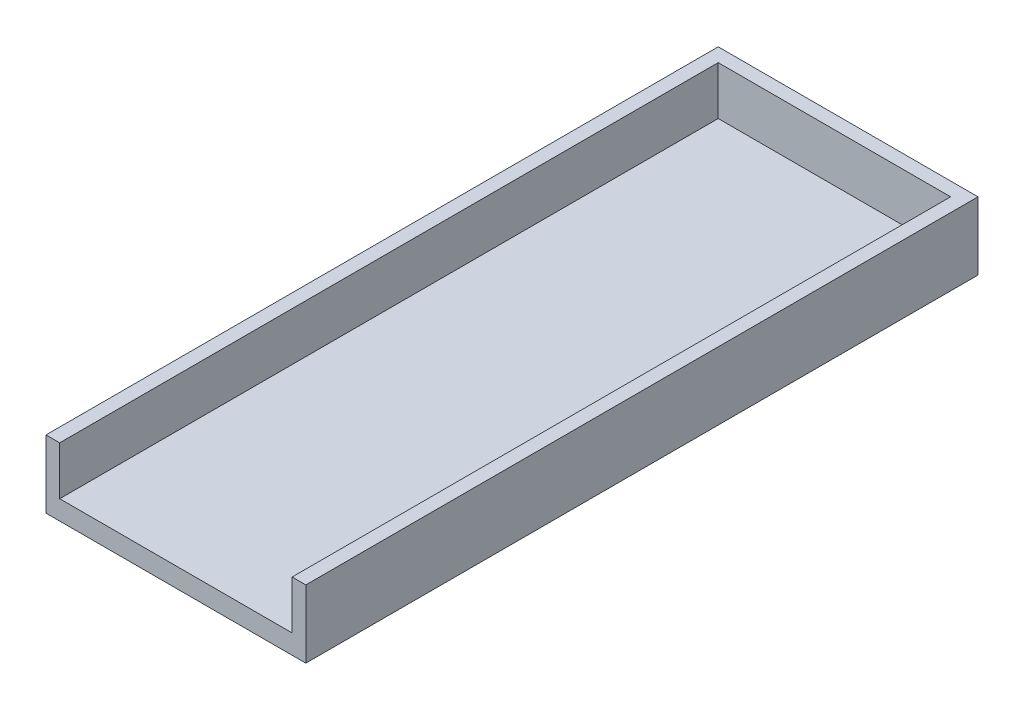
ISO-10303-21;
HEADER;
FILE_DESCRIPTION(('STEP AP214'),'2;1');
FILE_NAME('part.step','',(''),(''),'','','');
FILE_SCHEMA(('AUTOMOTIVE_DESIGN { 1 0 10303 214 1 1 1 1 }'));
ENDSEC;
DATA;
#1=APPLICATION_CONTEXT('core data for automotive mechanical design processes');
#2=APPLICATION_PROTOCOL_DEFINITION('international standard','automotive_design',2000,#1);
#3=PRODUCT_CONTEXT('',#1,'mechanical');
#4=PRODUCT('Part','Part','',(#3));
#5=PRODUCT_RELATED_PRODUCT_CATEGORY('part','',(#4));
#6=PRODUCT_DEFINITION_FORMATION('','',#4);
#7=PRODUCT_DEFINITION_CONTEXT('part definition',#1,'design');
#8=PRODUCT_DEFINITION('design','',#6,#7);
#9=PRODUCT_DEFINITION_SHAPE('','',#8);
#10=(LENGTH_UNIT() NAMED_UNIT(*) SI_UNIT(.MILLI.,.METRE.));
#11=(NAMED_UNIT(*) PLANE_ANGLE_UNIT() SI_UNIT($,.RADIAN.));
#12=(NAMED_UNIT(*) SI_UNIT($,.STERADIAN.) SOLID_ANGLE_UNIT());
#13=UNCERTAINTY_MEASURE_WITH_UNIT(LENGTH_MEASURE(1.E-05),#10,'distance_accuracy_value','');
#14=(GEOMETRIC_REPRESENTATION_CONTEXT(3) GLOBAL_UNCERTAINTY_ASSIGNED_CONTEXT((#13)) GLOBAL_UNIT_ASSIGNED_CONTEXT((#10,
#11,#12)) REPRESENTATION_CONTEXT('',''));
#15=CARTESIAN_POINT('',(0.,0.,0.));
#16=DIRECTION('',(0.,0.,1.));
#17=DIRECTION('',(1.,0.,0.));
#18=AXIS2_PLACEMENT_3D('',#15,#16,#17);
#19=CARTESIAN_POINT('',(0.,12.5,0.));
#20=DIRECTION('',(-1.,0.,0.));
#21=DIRECTION('',(0.,0.,1.));
#22=AXIS2_PLACEMENT_3D('',#19,#20,#21);
#23=PLANE('',#22);
#24=DIRECTION('',(0.,0.,-1.));
#25=VECTOR('',#24,1.);
#26=CARTESIAN_POINT('',(0.,12.5,0.));
#27=LINE('',#26,#25);
#28=CARTESIAN_POINT('',(0.,12.5,-160.));
#29=VERTEX_POINT('',#28);
#30=CARTESIAN_POINT('',(0.,12.5,-330.));
#31=VERTEX_POINT('',#30);
#32=EDGE_CURVE('E116',#29,#31,#27,.T.);
#33=ORIENTED_EDGE('',*,*,#32,.F.);
#34=DIRECTION('',(0.,1.,0.));
#35=VECTOR('',#34,1.);
#36=CARTESIAN_POINT('',(0.,0.,-160.));
#37=LINE('',#36,#35);
#38=CARTESIAN_POINT('',(0.,0.,-160.));
#39=VERTEX_POINT('',#38);
#40=EDGE_CURVE('E115',#39,#29,#37,.T.);
#41=ORIENTED_EDGE('',*,*,#40,.F.);
#42=DIRECTION('',(0.,0.,-1.));
#43=VECTOR('',#42,1.);
#44=CARTESIAN_POINT('',(0.,0.,0.));
#45=LINE('',#44,#43);
#46=CARTESIAN_POINT('',(0.,0.,-330.));
#47=VERTEX_POINT('',#46);
#48=EDGE_CURVE('E102',#39,#47,#45,.T.);
#49=ORIENTED_EDGE('',*,*,#48,.T.);
#50=DIRECTION('',(0.,-1.,0.));
#51=VECTOR('',#50,1.);
#52=CARTESIAN_POINT('',(0.,12.5,-330.));
#53=LINE('',#52,#51);
#54=EDGE_CURVE('E11',#31,#47,#53,.T.);
#55=ORIENTED_EDGE('',*,*,#54,.F.);
#56=EDGE_LOOP('',(#33,#41,#49,#55));
#57=FACE_BOUND('',#56,.T.);
#58=ADVANCED_FACE('F39',(#57),#23,.F.);
#59=CARTESIAN_POINT('',(0.,12.5,-330.));
#60=DIRECTION('',(0.,0.,-1.));
#61=DIRECTION('',(-1.,0.,0.));
#62=AXIS2_PLACEMENT_3D('',#59,#60,#61);
#63=PLANE('',#62);
#64=DIRECTION('',(1.,0.,0.));
#65=VECTOR('',#64,1.);
#66=CARTESIAN_POINT('',(0.,0.,-330.));
#67=LINE('',#66,#65);
#68=CARTESIAN_POINT('',(60.,0.,-330.));
#69=VERTEX_POINT('',#68);
#70=EDGE_CURVE('E109',#47,#69,#67,.T.);
#71=ORIENTED_EDGE('',*,*,#70,.T.);
#72=DIRECTION('',(0.,-1.,0.));
#73=VECTOR('',#72,1.);
#74=CARTESIAN_POINT('',(60.,12.5,-330.));
#75=LINE('',#74,#73);
#76=CARTESIAN_POINT('',(60.,12.5,-330.));
#77=VERTEX_POINT('',#76);
#78=EDGE_CURVE('E49',#77,#69,#75,.T.);
#79=ORIENTED_EDGE('',*,*,#78,.F.);
#80=DIRECTION('',(1.,0.,0.));
#81=VECTOR('',#80,1.);
#82=CARTESIAN_POINT('',(0.,12.5,-330.));
#83=LINE('',#82,#81);
#84=EDGE_CURVE('E156',#31,#77,#83,.T.);
#85=ORIENTED_EDGE('',*,*,#84,.F.);
#86=ORIENTED_EDGE('',*,*,#54,.T.);
#87=EDGE_LOOP('',(#71,#79,#85,#86));
#88=FACE_BOUND('',#87,.T.);
#89=ADVANCED_FACE('F184',(#88),#63,.F.);
#90=CARTESIAN_POINT('',(60.,12.5,0.));
#91=DIRECTION('',(-1.,0.,0.));
#92=DIRECTION('',(0.,0.,1.));
#93=AXIS2_PLACEMENT_3D('',#90,#91,#92);
#94=PLANE('',#93);
#95=DIRECTION('',(0.,0.,-1.));
#96=VECTOR('',#95,1.);
#97=CARTESIAN_POINT('',(60.,0.,0.));
#98=LINE('',#97,#96);
#99=CARTESIAN_POINT('',(60.,0.,-160.));
#100=VERTEX_POINT('',#99);
#101=EDGE_CURVE('E151',#100,#69,#98,.T.);
#102=ORIENTED_EDGE('',*,*,#101,.F.);
#103=DIRECTION('',(0.,-1.,0.));
#104=VECTOR('',#103,1.);
#105=CARTESIAN_POINT('',(60.,0.,-160.));
#106=LINE('',#105,#104);
#107=CARTESIAN_POINT('',(60.,12.5,-160.));
#108=VERTEX_POINT('',#107);
#109=EDGE_CURVE('E125',#108,#100,#106,.T.);
#110=ORIENTED_EDGE('',*,*,#109,.F.);
#111=DIRECTION('',(0.,0.,-1.));
#112=VECTOR('',#111,1.);
#113=CARTESIAN_POINT('',(60.,12.5,0.));
#114=LINE('',#113,#112);
#115=EDGE_CURVE('E57',#108,#77,#114,.T.);
#116=ORIENTED_EDGE('',*,*,#115,.T.);
#117=ORIENTED_EDGE('',*,*,#78,.T.);
#118=EDGE_LOOP('',(#102,#110,#116,#117));
#119=FACE_BOUND('',#118,.T.);
#120=ADVANCED_FACE('F185',(#119),#94,.T.);
#121=CARTESIAN_POINT('',(0.,12.5,-333.535533905933));
#122=DIRECTION('',(0.,0.,1.));
#123=DIRECTION('',(1.,0.,0.));
#124=AXIS2_PLACEMENT_3D('',#121,#122,#123);
#125=PLANE('',#124);
#126=DIRECTION('',(0.,-1.,0.));
#127=VECTOR('',#126,1.);
#128=CARTESIAN_POINT('',(63.5355339059327,12.5,-333.535533905933));
#129=LINE('',#128,#127);
#130=CARTESIAN_POINT('',(63.5355339059327,12.5,-333.535533905933));
#131=VERTEX_POINT('',#130);
#132=CARTESIAN_POINT('',(63.5355339059327,-5.,-333.535533905933));
#133=VERTEX_POINT('',#132);
#134=EDGE_CURVE('E158',#131,#133,#129,.T.);
#135=ORIENTED_EDGE('',*,*,#134,.T.);
#136=DIRECTION('',(1.,0.,0.));
#137=VECTOR('',#136,1.);
#138=CARTESIAN_POINT('',(-3.53553390593271,-5.,-333.535533905933));
#139=LINE('',#138,#137);
#140=CARTESIAN_POINT('',(-3.53553390593271,-5.,-333.535533905933));
#141=VERTEX_POINT('',#140);
#142=EDGE_CURVE('E143',#141,#133,#139,.T.);
#143=ORIENTED_EDGE('',*,*,#142,.F.);
#144=DIRECTION('',(0.,-1.,0.));
#145=VECTOR('',#144,1.);
#146=CARTESIAN_POINT('',(-3.53553390593267,12.5,-333.535533905933));
#147=LINE('',#146,#145);
#148=CARTESIAN_POINT('',(-3.53553390593267,12.5,-333.535533905933));
#149=VERTEX_POINT('',#148);
#150=EDGE_CURVE('E43',#149,#141,#147,.T.);
#151=ORIENTED_EDGE('',*,*,#150,.F.);
#152=DIRECTION('',(-1.,0.,0.));
#153=VECTOR('',#152,1.);
#154=CARTESIAN_POINT('',(0.,12.5,-333.535533905933));
#155=LINE('',#154,#153);
#156=EDGE_CURVE('E147',#131,#149,#155,.T.);
#157=ORIENTED_EDGE('',*,*,#156,.F.);
#158=EDGE_LOOP('',(#135,#143,#151,#157));
#159=FACE_BOUND('',#158,.T.);
#160=ADVANCED_FACE('F41',(#159),#125,.F.);
#161=CARTESIAN_POINT('',(-3.53553390593271,12.5,0.));
#162=DIRECTION('',(-1.,0.,0.));
#163=DIRECTION('',(0.,0.,1.));
#164=AXIS2_PLACEMENT_3D('',#161,#162,#163);
#165=PLANE('',#164);
#166=DIRECTION('',(0.,0.,-1.));
#167=VECTOR('',#166,1.);
#168=CARTESIAN_POINT('',(-3.53553390593271,-5.,3.53553390593275));
#169=LINE('',#168,#167);
#170=CARTESIAN_POINT('',(-3.53553390593271,-5.,-160.));
#171=VERTEX_POINT('',#170);
#172=EDGE_CURVE('E141',#171,#141,#169,.T.);
#173=ORIENTED_EDGE('',*,*,#172,.F.);
#174=DIRECTION('',(0.,-1.,0.));
#175=VECTOR('',#174,1.);
#176=CARTESIAN_POINT('',(-3.53553390593271,0.,-160.));
#177=LINE('',#176,#175);
#178=CARTESIAN_POINT('',(-3.53553390593271,12.5,-160.));
#179=VERTEX_POINT('',#178);
#180=EDGE_CURVE('E129',#179,#171,#177,.T.);
#181=ORIENTED_EDGE('',*,*,#180,.F.);
#182=DIRECTION('',(0.,0.,-1.));
#183=VECTOR('',#182,1.);
#184=CARTESIAN_POINT('',(-3.53553390593271,12.5,0.));
#185=LINE('',#184,#183);
#186=EDGE_CURVE('E150',#179,#149,#185,.T.);
#187=ORIENTED_EDGE('',*,*,#186,.T.);
#188=ORIENTED_EDGE('',*,*,#150,.T.);
#189=EDGE_LOOP('',(#173,#181,#187,#188));
#190=FACE_BOUND('',#189,.T.);
#191=ADVANCED_FACE('F169',(#190),#165,.T.);
#192=CARTESIAN_POINT('',(63.5355339059327,12.5,0.));
#193=DIRECTION('',(-1.,0.,0.));
#194=DIRECTION('',(0.,0.,1.));
#195=AXIS2_PLACEMENT_3D('',#192,#193,#194);
#196=PLANE('',#195);
#197=DIRECTION('',(0.,0.,-1.));
#198=VECTOR('',#197,1.);
#199=CARTESIAN_POINT('',(63.5355339059327,12.5,0.));
#200=LINE('',#199,#198);
#201=CARTESIAN_POINT('',(63.5355339059327,12.5,-160.));
#202=VERTEX_POINT('',#201);
#203=EDGE_CURVE('E153',#202,#131,#200,.T.);
#204=ORIENTED_EDGE('',*,*,#203,.F.);
#205=DIRECTION('',(0.,1.,0.));
#206=VECTOR('',#205,1.);
#207=CARTESIAN_POINT('',(63.5355339059327,0.,-160.));
#208=LINE('',#207,#206);
#209=CARTESIAN_POINT('',(63.5355339059327,-5.,-160.));
#210=VERTEX_POINT('',#209);
#211=EDGE_CURVE('E135',#210,#202,#208,.T.);
#212=ORIENTED_EDGE('',*,*,#211,.F.);
#213=DIRECTION('',(0.,0.,1.));
#214=VECTOR('',#213,1.);
#215=CARTESIAN_POINT('',(63.5355339059327,-5.,3.53553390593275));
#216=LINE('',#215,#214);
#217=EDGE_CURVE('E112',#133,#210,#216,.T.);
#218=ORIENTED_EDGE('',*,*,#217,.F.);
#219=ORIENTED_EDGE('',*,*,#134,.F.);
#220=EDGE_LOOP('',(#204,#212,#218,#219));
#221=FACE_BOUND('',#220,.T.);
#222=ADVANCED_FACE('F177',(#221),#196,.F.);
#223=CARTESIAN_POINT('',(0.,12.5,0.));
#224=DIRECTION('',(0.,1.,0.));
#225=DIRECTION('',(0.,0.,1.));
#226=AXIS2_PLACEMENT_3D('',#223,#224,#225);
#227=PLANE('',#226);
#228=ORIENTED_EDGE('',*,*,#115,.F.);
#229=DIRECTION('',(-1.,0.,0.));
#230=VECTOR('',#229,1.);
#231=CARTESIAN_POINT('',(0.,12.5,-160.));
#232=LINE('',#231,#230);
#233=EDGE_CURVE('E138',#202,#108,#232,.T.);
#234=ORIENTED_EDGE('',*,*,#233,.F.);
#235=ORIENTED_EDGE('',*,*,#203,.T.);
#236=ORIENTED_EDGE('',*,*,#156,.T.);
#237=ORIENTED_EDGE('',*,*,#186,.F.);
#238=DIRECTION('',(-1.,0.,0.));
#239=VECTOR('',#238,1.);
#240=CARTESIAN_POINT('',(0.,12.5,-160.));
#241=LINE('',#240,#239);
#242=EDGE_CURVE('E120',#29,#179,#241,.T.);
#243=ORIENTED_EDGE('',*,*,#242,.F.);
#244=ORIENTED_EDGE('',*,*,#32,.T.);
#245=ORIENTED_EDGE('',*,*,#84,.T.);
#246=EDGE_LOOP('',(#228,#234,#235,#236,#237,#243,#244,#245));
#247=FACE_BOUND('',#246,.T.);
#248=ADVANCED_FACE('F180',(#247),#227,.T.);
#249=CARTESIAN_POINT('',(0.,0.,0.));
#250=DIRECTION('',(0.,-1.,0.));
#251=DIRECTION('',(0.,0.,-1.));
#252=AXIS2_PLACEMENT_3D('',#249,#250,#251);
#253=PLANE('',#252);
#254=ORIENTED_EDGE('',*,*,#48,.F.);
#255=DIRECTION('',(-1.,0.,0.));
#256=VECTOR('',#255,1.);
#257=CARTESIAN_POINT('',(0.,0.,-160.));
#258=LINE('',#257,#256);
#259=EDGE_CURVE('E107',#100,#39,#258,.T.);
#260=ORIENTED_EDGE('',*,*,#259,.F.);
#261=ORIENTED_EDGE('',*,*,#101,.T.);
#262=ORIENTED_EDGE('',*,*,#70,.F.);
#263=EDGE_LOOP('',(#254,#260,#261,#262));
#264=FACE_BOUND('',#263,.T.);
#265=ADVANCED_FACE('F104',(#264),#253,.F.);
#266=CARTESIAN_POINT('',(0.,-5.,0.));
#267=DIRECTION('',(0.,-1.,0.));
#268=DIRECTION('',(0.,0.,-1.));
#269=AXIS2_PLACEMENT_3D('',#266,#267,#268);
#270=PLANE('',#269);
#271=ORIENTED_EDGE('',*,*,#217,.T.);
#272=DIRECTION('',(1.,0.,0.));
#273=VECTOR('',#272,1.);
#274=CARTESIAN_POINT('',(0.,-5.,-160.));
#275=LINE('',#274,#273);
#276=EDGE_CURVE('E132',#171,#210,#275,.T.);
#277=ORIENTED_EDGE('',*,*,#276,.F.);
#278=ORIENTED_EDGE('',*,*,#172,.T.);
#279=ORIENTED_EDGE('',*,*,#142,.T.);
#280=EDGE_LOOP('',(#271,#277,#278,#279));
#281=FACE_BOUND('',#280,.T.);
#282=ADVANCED_FACE('F173',(#281),#270,.T.);
#283=CARTESIAN_POINT('',(0.,0.,-160.));
#284=DIRECTION('',(0.,0.,1.));
#285=DIRECTION('',(1.,0.,0.));
#286=AXIS2_PLACEMENT_3D('',#283,#284,#285);
#287=PLANE('',#286);
#288=ORIENTED_EDGE('',*,*,#259,.T.);
#289=ORIENTED_EDGE('',*,*,#40,.T.);
#290=ORIENTED_EDGE('',*,*,#242,.T.);
#291=ORIENTED_EDGE('',*,*,#180,.T.);
#292=ORIENTED_EDGE('',*,*,#276,.T.);
#293=ORIENTED_EDGE('',*,*,#211,.T.);
#294=ORIENTED_EDGE('',*,*,#233,.T.);
#295=ORIENTED_EDGE('',*,*,#109,.T.);
#296=EDGE_LOOP('',(#288,#289,#290,#291,#292,#293,#294,#295));
#297=FACE_BOUND('',#296,.T.);
#298=ADVANCED_FACE('F123',(#297),#287,.T.);
#299=CLOSED_SHELL('',(#58,#89,#120,#160,#191,#222,#248,#265,#282,#298));
#300=MANIFOLD_SOLID_BREP('B2',#299);
#301=ADVANCED_BREP_SHAPE_REPRESENTATION('',(#18,#300),#14);
#302=SHAPE_DEFINITION_REPRESENTATION(#9,#301);
ENDSEC;
END-ISO-10303-21;
